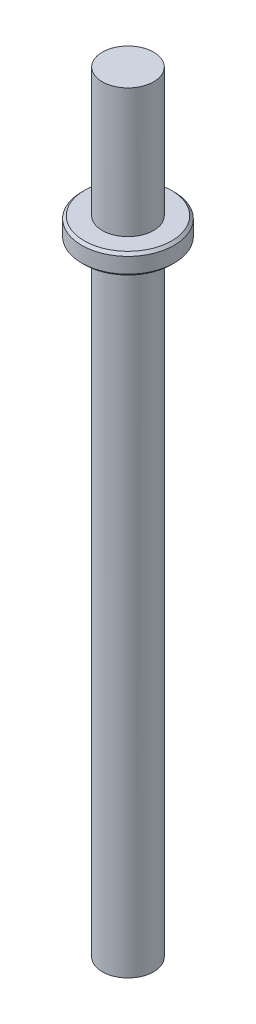
ISO-10303-21;
HEADER;
FILE_DESCRIPTION(('STEP AP214'),'2;1');
FILE_NAME('part.step','',(''),(''),'','','');
FILE_SCHEMA(('AUTOMOTIVE_DESIGN { 1 0 10303 214 1 1 1 1 }'));
ENDSEC;
DATA;
#1=APPLICATION_CONTEXT('core data for automotive mechanical design processes');
#2=APPLICATION_PROTOCOL_DEFINITION('international standard','automotive_design',2000,#1);
#3=PRODUCT_CONTEXT('',#1,'mechanical');
#4=PRODUCT('Part','Part','',(#3));
#5=PRODUCT_RELATED_PRODUCT_CATEGORY('part','',(#4));
#6=PRODUCT_DEFINITION_FORMATION('','',#4);
#7=PRODUCT_DEFINITION_CONTEXT('part definition',#1,'design');
#8=PRODUCT_DEFINITION('design','',#6,#7);
#9=PRODUCT_DEFINITION_SHAPE('','',#8);
#10=(LENGTH_UNIT() NAMED_UNIT(*) SI_UNIT(.MILLI.,.METRE.));
#11=(NAMED_UNIT(*) PLANE_ANGLE_UNIT() SI_UNIT($,.RADIAN.));
#12=(NAMED_UNIT(*) SI_UNIT($,.STERADIAN.) SOLID_ANGLE_UNIT());
#13=UNCERTAINTY_MEASURE_WITH_UNIT(LENGTH_MEASURE(1.E-05),#10,'distance_accuracy_value','');
#14=(GEOMETRIC_REPRESENTATION_CONTEXT(3) GLOBAL_UNCERTAINTY_ASSIGNED_CONTEXT((#13)) GLOBAL_UNIT_ASSIGNED_CONTEXT((#10,
#11,#12)) REPRESENTATION_CONTEXT('',''));
#15=CARTESIAN_POINT('',(0.,0.,0.));
#16=DIRECTION('',(0.,0.,1.));
#17=DIRECTION('',(1.,0.,0.));
#18=AXIS2_PLACEMENT_3D('',#15,#16,#17);
#19=CARTESIAN_POINT('',(-12.9166666666667,138.125000000001,0.));
#20=DIRECTION('',(0.,1.,0.));
#21=DIRECTION('',(-1.,0.,0.));
#22=AXIS2_PLACEMENT_3D('',#19,#20,#21);
#23=PLANE('',#22);
#24=CARTESIAN_POINT('',(-2.91666666666667,138.125000000001,0.));
#25=DIRECTION('',(0.,1.,0.));
#26=DIRECTION('',(-1.,0.,0.));
#27=AXIS2_PLACEMENT_3D('',#24,#25,#26);
#28=CIRCLE('',#27,10.);
#29=CARTESIAN_POINT('',(-12.9166666666667,138.125000000001,0.));
#30=VERTEX_POINT('',#29);
#31=EDGE_CURVE('E54',#30,#30,#28,.T.);
#32=ORIENTED_EDGE('',*,*,#31,.T.);
#33=EDGE_LOOP('',(#32));
#34=FACE_BOUND('',#33,.T.);
#35=ADVANCED_FACE('F31',(#34),#23,.T.);
#36=CARTESIAN_POINT('',(-2.91666666666667,138.125000000001,0.));
#37=DIRECTION('',(0.,1.,0.));
#38=DIRECTION('',(-1.,0.,0.));
#39=AXIS2_PLACEMENT_3D('',#36,#37,#38);
#40=CYLINDRICAL_SURFACE('',#39,10.);
#41=CARTESIAN_POINT('',(-2.91666666666667,88.,0.));
#42=DIRECTION('',(0.,1.,0.));
#43=DIRECTION('',(0.,0.,1.));
#44=AXIS2_PLACEMENT_3D('',#41,#42,#43);
#45=CIRCLE('',#44,10.);
#46=CARTESIAN_POINT('',(-2.91666666666667,88.,10.));
#47=VERTEX_POINT('',#46);
#48=EDGE_CURVE('E51',#47,#47,#45,.F.);
#49=ORIENTED_EDGE('',*,*,#48,.F.);
#50=EDGE_LOOP('',(#49));
#51=FACE_BOUND('',#50,.T.);
#52=ORIENTED_EDGE('',*,*,#31,.F.);
#53=EDGE_LOOP('',(#52));
#54=FACE_BOUND('',#53,.T.);
#55=ADVANCED_FACE('F72',(#51,#54),#40,.T.);
#56=CARTESIAN_POINT('',(-2.91666666666667,88.,0.));
#57=DIRECTION('',(0.,1.,0.));
#58=DIRECTION('',(0.,0.,1.));
#59=AXIS2_PLACEMENT_3D('',#56,#57,#58);
#60=PLANE('',#59);
#61=CARTESIAN_POINT('',(-2.91666666666667,88.,0.));
#62=DIRECTION('',(0.,1.,0.));
#63=DIRECTION('',(0.,0.,1.));
#64=AXIS2_PLACEMENT_3D('',#61,#62,#63);
#65=CIRCLE('',#64,17.);
#66=CARTESIAN_POINT('',(-2.91666666666667,88.,17.));
#67=VERTEX_POINT('',#66);
#68=EDGE_CURVE('E10',#67,#67,#65,.T.);
#69=ORIENTED_EDGE('',*,*,#68,.T.);
#70=EDGE_LOOP('',(#69));
#71=FACE_BOUND('',#70,.T.);
#72=ORIENTED_EDGE('',*,*,#48,.T.);
#73=EDGE_LOOP('',(#72));
#74=FACE_BOUND('',#73,.T.);
#75=ADVANCED_FACE('F83',(#71,#74),#60,.T.);
#76=CARTESIAN_POINT('',(-2.91666666666667,80.,0.));
#77=DIRECTION('',(0.,1.,0.));
#78=DIRECTION('',(0.,0.,1.));
#79=AXIS2_PLACEMENT_3D('',#76,#77,#78);
#80=PLANE('',#79);
#81=CARTESIAN_POINT('',(-2.91666666666667,80.,0.));
#82=DIRECTION('',(0.,1.,0.));
#83=DIRECTION('',(0.,0.,1.));
#84=AXIS2_PLACEMENT_3D('',#81,#82,#83);
#85=CIRCLE('',#84,17.0000000000001);
#86=CARTESIAN_POINT('',(-2.91666666666667,80.,17.0000000000001));
#87=VERTEX_POINT('',#86);
#88=EDGE_CURVE('E38',#87,#87,#85,.F.);
#89=ORIENTED_EDGE('',*,*,#88,.T.);
#90=EDGE_LOOP('',(#89));
#91=FACE_BOUND('',#90,.T.);
#92=CARTESIAN_POINT('',(-2.91666666666667,80.,0.));
#93=DIRECTION('',(0.,1.,0.));
#94=DIRECTION('',(0.,0.,1.));
#95=AXIS2_PLACEMENT_3D('',#92,#93,#94);
#96=CIRCLE('',#95,10.);
#97=CARTESIAN_POINT('',(-2.91666666666667,80.,10.));
#98=VERTEX_POINT('',#97);
#99=EDGE_CURVE('E60',#98,#98,#96,.T.);
#100=ORIENTED_EDGE('',*,*,#99,.T.);
#101=EDGE_LOOP('',(#100));
#102=FACE_BOUND('',#101,.T.);
#103=ADVANCED_FACE('F64',(#91,#102),#80,.F.);
#104=CARTESIAN_POINT('',(-2.91666666666667,88.,0.));
#105=DIRECTION('',(0.,-1.,0.));
#106=DIRECTION('',(0.,0.,-1.));
#107=AXIS2_PLACEMENT_3D('',#104,#105,#106);
#108=CYLINDRICAL_SURFACE('',#107,18.);
#109=CARTESIAN_POINT('',(-2.91666666666667,80.9999999999999,0.));
#110=DIRECTION('',(0.,1.,0.));
#111=DIRECTION('',(0.,0.,1.));
#112=AXIS2_PLACEMENT_3D('',#109,#110,#111);
#113=CIRCLE('',#112,18.);
#114=CARTESIAN_POINT('',(-2.91666666666667,80.9999999999999,18.));
#115=VERTEX_POINT('',#114);
#116=EDGE_CURVE('E42',#115,#115,#113,.T.);
#117=ORIENTED_EDGE('',*,*,#116,.T.);
#118=EDGE_LOOP('',(#117));
#119=FACE_BOUND('',#118,.T.);
#120=CARTESIAN_POINT('',(-2.91666666666667,87.,0.));
#121=DIRECTION('',(0.,1.,0.));
#122=DIRECTION('',(0.,0.,1.));
#123=AXIS2_PLACEMENT_3D('',#120,#121,#122);
#124=CIRCLE('',#123,18.);
#125=CARTESIAN_POINT('',(-2.91666666666667,87.,18.));
#126=VERTEX_POINT('',#125);
#127=EDGE_CURVE('E46',#126,#126,#124,.F.);
#128=ORIENTED_EDGE('',*,*,#127,.T.);
#129=EDGE_LOOP('',(#128));
#130=FACE_BOUND('',#129,.T.);
#131=ADVANCED_FACE('F78',(#119,#130),#108,.T.);
#132=CARTESIAN_POINT('',(-12.9166666666666,-161.874999999999,0.));
#133=DIRECTION('',(0.,-1.,0.));
#134=DIRECTION('',(1.,0.,0.));
#135=AXIS2_PLACEMENT_3D('',#132,#133,#134);
#136=PLANE('',#135);
#137=CARTESIAN_POINT('',(-2.91666666666664,-161.874999999999,0.));
#138=DIRECTION('',(0.,1.,0.));
#139=DIRECTION('',(-1.,0.,0.));
#140=AXIS2_PLACEMENT_3D('',#137,#138,#139);
#141=CIRCLE('',#140,10.);
#142=CARTESIAN_POINT('',(-12.9166666666666,-161.874999999999,0.));
#143=VERTEX_POINT('',#142);
#144=EDGE_CURVE('E57',#143,#143,#141,.T.);
#145=ORIENTED_EDGE('',*,*,#144,.F.);
#146=EDGE_LOOP('',(#145));
#147=FACE_BOUND('',#146,.T.);
#148=ADVANCED_FACE('F69',(#147),#136,.T.);
#149=ORIENTED_EDGE('',*,*,#144,.T.);
#150=EDGE_LOOP('',(#149));
#151=FACE_BOUND('',#150,.T.);
#152=ORIENTED_EDGE('',*,*,#99,.F.);
#153=EDGE_LOOP('',(#152));
#154=FACE_BOUND('',#153,.T.);
#155=ADVANCED_FACE('F66',(#151,#154),#40,.T.);
#156=CARTESIAN_POINT('',(-2.91666666666667,80.9999999999999,0.));
#157=DIRECTION('',(0.,1.,0.));
#158=DIRECTION('',(0.,0.,1.));
#159=AXIS2_PLACEMENT_3D('',#156,#157,#158);
#160=CONICAL_SURFACE('',#159,18.,0.785398163397441);
#161=ORIENTED_EDGE('',*,*,#88,.F.);
#162=EDGE_LOOP('',(#161));
#163=FACE_BOUND('',#162,.T.);
#164=ORIENTED_EDGE('',*,*,#116,.F.);
#165=EDGE_LOOP('',(#164));
#166=FACE_BOUND('',#165,.T.);
#167=ADVANCED_FACE('F68',(#163,#166),#160,.T.);
#168=CARTESIAN_POINT('',(-2.91666666666667,88.,0.));
#169=DIRECTION('',(0.,-1.,0.));
#170=DIRECTION('',(0.,0.,-1.));
#171=AXIS2_PLACEMENT_3D('',#168,#169,#170);
#172=CONICAL_SURFACE('',#171,17.,0.785398163397441);
#173=ORIENTED_EDGE('',*,*,#127,.F.);
#174=EDGE_LOOP('',(#173));
#175=FACE_BOUND('',#174,.T.);
#176=ORIENTED_EDGE('',*,*,#68,.F.);
#177=EDGE_LOOP('',(#176));
#178=FACE_BOUND('',#177,.T.);
#179=ADVANCED_FACE('F33',(#175,#178),#172,.T.);
#180=CLOSED_SHELL('',(#35,#55,#75,#103,#131,#148,#155,#167,#179));
#181=MANIFOLD_SOLID_BREP('B2',#180);
#182=ADVANCED_BREP_SHAPE_REPRESENTATION('',(#18,#181),#14);
#183=SHAPE_DEFINITION_REPRESENTATION(#9,#182);
ENDSEC;
END-ISO-10303-21;
